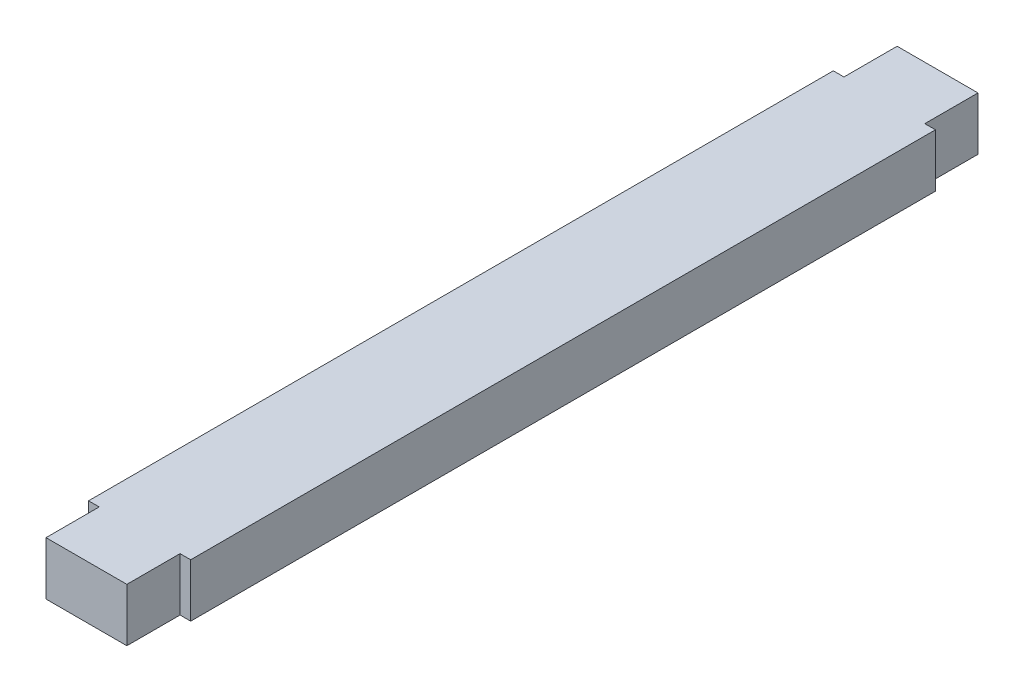
ISO-10303-21;
HEADER;
FILE_DESCRIPTION(('STEP AP214'),'2;1');
FILE_NAME('part.step','',(''),(''),'','','');
FILE_SCHEMA(('AUTOMOTIVE_DESIGN { 1 0 10303 214 1 1 1 1 }'));
ENDSEC;
DATA;
#1=APPLICATION_CONTEXT('core data for automotive mechanical design processes');
#2=APPLICATION_PROTOCOL_DEFINITION('international standard','automotive_design',2000,#1);
#3=PRODUCT_CONTEXT('',#1,'mechanical');
#4=PRODUCT('Part','Part','',(#3));
#5=PRODUCT_RELATED_PRODUCT_CATEGORY('part','',(#4));
#6=PRODUCT_DEFINITION_FORMATION('','',#4);
#7=PRODUCT_DEFINITION_CONTEXT('part definition',#1,'design');
#8=PRODUCT_DEFINITION('design','',#6,#7);
#9=PRODUCT_DEFINITION_SHAPE('','',#8);
#10=(LENGTH_UNIT() NAMED_UNIT(*) SI_UNIT(.MILLI.,.METRE.));
#11=(NAMED_UNIT(*) PLANE_ANGLE_UNIT() SI_UNIT($,.RADIAN.));
#12=(NAMED_UNIT(*) SI_UNIT($,.STERADIAN.) SOLID_ANGLE_UNIT());
#13=UNCERTAINTY_MEASURE_WITH_UNIT(LENGTH_MEASURE(1.E-05),#10,'distance_accuracy_value','');
#14=(GEOMETRIC_REPRESENTATION_CONTEXT(3) GLOBAL_UNCERTAINTY_ASSIGNED_CONTEXT((#13)) GLOBAL_UNIT_ASSIGNED_CONTEXT((#10,
#11,#12)) REPRESENTATION_CONTEXT('',''));
#15=CARTESIAN_POINT('',(0.,0.,0.));
#16=DIRECTION('',(0.,0.,1.));
#17=DIRECTION('',(1.,0.,0.));
#18=AXIS2_PLACEMENT_3D('',#15,#16,#17);
#19=CARTESIAN_POINT('',(0.,6.35,-17.78));
#20=DIRECTION('',(0.,0.,1.));
#21=DIRECTION('',(1.,0.,0.));
#22=AXIS2_PLACEMENT_3D('',#19,#20,#21);
#23=PLANE('',#22);
#24=DIRECTION('',(-1.,0.,0.));
#25=VECTOR('',#24,1.);
#26=CARTESIAN_POINT('',(0.,0.,-17.78));
#27=LINE('',#26,#25);
#28=CARTESIAN_POINT('',(0.,0.,-17.78));
#29=VERTEX_POINT('',#28);
#30=CARTESIAN_POINT('',(-1.27,0.,-17.78));
#31=VERTEX_POINT('',#30);
#32=EDGE_CURVE('E160',#29,#31,#27,.T.);
#33=ORIENTED_EDGE('',*,*,#32,.T.);
#34=DIRECTION('',(0.,-1.,0.));
#35=VECTOR('',#34,1.);
#36=CARTESIAN_POINT('',(-1.27,6.35,-17.78));
#37=LINE('',#36,#35);
#38=CARTESIAN_POINT('',(-1.27,6.35,-17.78));
#39=VERTEX_POINT('',#38);
#40=EDGE_CURVE('E48',#39,#31,#37,.T.);
#41=ORIENTED_EDGE('',*,*,#40,.F.);
#42=DIRECTION('',(-1.,0.,0.));
#43=VECTOR('',#42,1.);
#44=CARTESIAN_POINT('',(0.,6.35,-17.78));
#45=LINE('',#44,#43);
#46=CARTESIAN_POINT('',(0.,6.35,-17.78));
#47=VERTEX_POINT('',#46);
#48=EDGE_CURVE('E250',#47,#39,#45,.T.);
#49=ORIENTED_EDGE('',*,*,#48,.F.);
#50=DIRECTION('',(0.,-1.,0.));
#51=VECTOR('',#50,1.);
#52=CARTESIAN_POINT('',(0.,6.35,-17.78));
#53=LINE('',#52,#51);
#54=EDGE_CURVE('E11',#47,#29,#53,.T.);
#55=ORIENTED_EDGE('',*,*,#54,.T.);
#56=EDGE_LOOP('',(#33,#41,#49,#55));
#57=FACE_BOUND('',#56,.T.);
#58=ADVANCED_FACE('F40',(#57),#23,.F.);
#59=CARTESIAN_POINT('',(-1.27,6.35,-17.78));
#60=DIRECTION('',(-1.,0.,0.));
#61=DIRECTION('',(0.,0.,1.));
#62=AXIS2_PLACEMENT_3D('',#59,#60,#61);
#63=PLANE('',#62);
#64=DIRECTION('',(0.,0.,-1.));
#65=VECTOR('',#64,1.);
#66=CARTESIAN_POINT('',(-1.27,0.,-17.78));
#67=LINE('',#66,#65);
#68=CARTESIAN_POINT('',(-1.27,0.,-24.13));
#69=VERTEX_POINT('',#68);
#70=EDGE_CURVE('E162',#31,#69,#67,.T.);
#71=ORIENTED_EDGE('',*,*,#70,.T.);
#72=DIRECTION('',(0.,-1.,0.));
#73=VECTOR('',#72,1.);
#74=CARTESIAN_POINT('',(-1.27,6.35,-24.13));
#75=LINE('',#74,#73);
#76=CARTESIAN_POINT('',(-1.27,6.35,-24.13));
#77=VERTEX_POINT('',#76);
#78=EDGE_CURVE('E200',#77,#69,#75,.T.);
#79=ORIENTED_EDGE('',*,*,#78,.F.);
#80=DIRECTION('',(0.,0.,-1.));
#81=VECTOR('',#80,1.);
#82=CARTESIAN_POINT('',(-1.27,6.35,-17.78));
#83=LINE('',#82,#81);
#84=EDGE_CURVE('E209',#39,#77,#83,.T.);
#85=ORIENTED_EDGE('',*,*,#84,.F.);
#86=ORIENTED_EDGE('',*,*,#40,.T.);
#87=EDGE_LOOP('',(#71,#79,#85,#86));
#88=FACE_BOUND('',#87,.T.);
#89=ADVANCED_FACE('F207',(#88),#63,.F.);
#90=CARTESIAN_POINT('',(-1.27,6.35,-24.13));
#91=DIRECTION('',(0.,0.,1.));
#92=DIRECTION('',(1.,0.,0.));
#93=AXIS2_PLACEMENT_3D('',#90,#91,#92);
#94=PLANE('',#93);
#95=DIRECTION('',(-1.,0.,0.));
#96=VECTOR('',#95,1.);
#97=CARTESIAN_POINT('',(-1.27,0.,-24.13));
#98=LINE('',#97,#96);
#99=CARTESIAN_POINT('',(-10.922,0.,-24.13));
#100=VERTEX_POINT('',#99);
#101=EDGE_CURVE('E164',#69,#100,#98,.T.);
#102=ORIENTED_EDGE('',*,*,#101,.T.);
#103=DIRECTION('',(0.,-1.,0.));
#104=VECTOR('',#103,1.);
#105=CARTESIAN_POINT('',(-10.922,6.35,-24.13));
#106=LINE('',#105,#104);
#107=CARTESIAN_POINT('',(-10.922,6.35,-24.13));
#108=VERTEX_POINT('',#107);
#109=EDGE_CURVE('E197',#108,#100,#106,.T.);
#110=ORIENTED_EDGE('',*,*,#109,.F.);
#111=DIRECTION('',(-1.,0.,0.));
#112=VECTOR('',#111,1.);
#113=CARTESIAN_POINT('',(-1.27,6.35,-24.13));
#114=LINE('',#113,#112);
#115=EDGE_CURVE('E230',#77,#108,#114,.T.);
#116=ORIENTED_EDGE('',*,*,#115,.F.);
#117=ORIENTED_EDGE('',*,*,#78,.T.);
#118=EDGE_LOOP('',(#102,#110,#116,#117));
#119=FACE_BOUND('',#118,.T.);
#120=ADVANCED_FACE('F221',(#119),#94,.F.);
#121=CARTESIAN_POINT('',(-10.922,6.35,-24.13));
#122=DIRECTION('',(1.,0.,0.));
#123=DIRECTION('',(0.,0.,-1.));
#124=AXIS2_PLACEMENT_3D('',#121,#122,#123);
#125=PLANE('',#124);
#126=DIRECTION('',(0.,0.,1.));
#127=VECTOR('',#126,1.);
#128=CARTESIAN_POINT('',(-10.922,0.,-24.13));
#129=LINE('',#128,#127);
#130=CARTESIAN_POINT('',(-10.922,0.,-17.78));
#131=VERTEX_POINT('',#130);
#132=EDGE_CURVE('E166',#100,#131,#129,.T.);
#133=ORIENTED_EDGE('',*,*,#132,.T.);
#134=DIRECTION('',(0.,-1.,0.));
#135=VECTOR('',#134,1.);
#136=CARTESIAN_POINT('',(-10.922,6.35,-17.78));
#137=LINE('',#136,#135);
#138=CARTESIAN_POINT('',(-10.922,6.35,-17.78));
#139=VERTEX_POINT('',#138);
#140=EDGE_CURVE('E194',#139,#131,#137,.T.);
#141=ORIENTED_EDGE('',*,*,#140,.F.);
#142=DIRECTION('',(0.,0.,1.));
#143=VECTOR('',#142,1.);
#144=CARTESIAN_POINT('',(-10.922,6.35,-24.13));
#145=LINE('',#144,#143);
#146=EDGE_CURVE('E227',#108,#139,#145,.T.);
#147=ORIENTED_EDGE('',*,*,#146,.F.);
#148=ORIENTED_EDGE('',*,*,#109,.T.);
#149=EDGE_LOOP('',(#133,#141,#147,#148));
#150=FACE_BOUND('',#149,.T.);
#151=ADVANCED_FACE('F225',(#150),#125,.F.);
#152=CARTESIAN_POINT('',(-10.922,6.35,-17.78));
#153=DIRECTION('',(0.,0.,1.));
#154=DIRECTION('',(1.,0.,0.));
#155=AXIS2_PLACEMENT_3D('',#152,#153,#154);
#156=PLANE('',#155);
#157=DIRECTION('',(-1.,0.,0.));
#158=VECTOR('',#157,1.);
#159=CARTESIAN_POINT('',(-10.922,0.,-17.78));
#160=LINE('',#159,#158);
#161=CARTESIAN_POINT('',(-12.192,0.,-17.78));
#162=VERTEX_POINT('',#161);
#163=EDGE_CURVE('E168',#131,#162,#160,.T.);
#164=ORIENTED_EDGE('',*,*,#163,.T.);
#165=DIRECTION('',(0.,-1.,0.));
#166=VECTOR('',#165,1.);
#167=CARTESIAN_POINT('',(-12.192,6.35,-17.78));
#168=LINE('',#167,#166);
#169=CARTESIAN_POINT('',(-12.192,6.35,-17.78));
#170=VERTEX_POINT('',#169);
#171=EDGE_CURVE('E191',#170,#162,#168,.T.);
#172=ORIENTED_EDGE('',*,*,#171,.F.);
#173=DIRECTION('',(-1.,0.,0.));
#174=VECTOR('',#173,1.);
#175=CARTESIAN_POINT('',(-10.922,6.35,-17.78));
#176=LINE('',#175,#174);
#177=EDGE_CURVE('E229',#139,#170,#176,.T.);
#178=ORIENTED_EDGE('',*,*,#177,.F.);
#179=ORIENTED_EDGE('',*,*,#140,.T.);
#180=EDGE_LOOP('',(#164,#172,#178,#179));
#181=FACE_BOUND('',#180,.T.);
#182=ADVANCED_FACE('F264',(#181),#156,.F.);
#183=CARTESIAN_POINT('',(-12.192,6.35,53.34));
#184=DIRECTION('',(1.,0.,0.));
#185=DIRECTION('',(0.,0.,-1.));
#186=AXIS2_PLACEMENT_3D('',#183,#184,#185);
#187=PLANE('',#186);
#188=DIRECTION('',(0.,0.,1.));
#189=VECTOR('',#188,1.);
#190=CARTESIAN_POINT('',(-12.192,0.,53.34));
#191=LINE('',#190,#189);
#192=CARTESIAN_POINT('',(-12.192,0.,71.12));
#193=VERTEX_POINT('',#192);
#194=EDGE_CURVE('E171',#162,#193,#191,.T.);
#195=ORIENTED_EDGE('',*,*,#194,.T.);
#196=DIRECTION('',(0.,-1.,0.));
#197=VECTOR('',#196,1.);
#198=CARTESIAN_POINT('',(-12.192,6.35,71.12));
#199=LINE('',#198,#197);
#200=CARTESIAN_POINT('',(-12.192,6.35,71.12));
#201=VERTEX_POINT('',#200);
#202=EDGE_CURVE('E188',#201,#193,#199,.T.);
#203=ORIENTED_EDGE('',*,*,#202,.F.);
#204=DIRECTION('',(0.,0.,1.));
#205=VECTOR('',#204,1.);
#206=CARTESIAN_POINT('',(-12.192,6.35,-17.78));
#207=LINE('',#206,#205);
#208=EDGE_CURVE('E232',#170,#201,#207,.T.);
#209=ORIENTED_EDGE('',*,*,#208,.F.);
#210=ORIENTED_EDGE('',*,*,#171,.T.);
#211=EDGE_LOOP('',(#195,#203,#209,#210));
#212=FACE_BOUND('',#211,.T.);
#213=ADVANCED_FACE('F267',(#212),#187,.F.);
#214=CARTESIAN_POINT('',(-12.192,6.35,71.12));
#215=DIRECTION('',(0.,0.,-1.));
#216=DIRECTION('',(-1.,0.,0.));
#217=AXIS2_PLACEMENT_3D('',#214,#215,#216);
#218=PLANE('',#217);
#219=DIRECTION('',(1.,0.,0.));
#220=VECTOR('',#219,1.);
#221=CARTESIAN_POINT('',(-12.192,0.,71.12));
#222=LINE('',#221,#220);
#223=CARTESIAN_POINT('',(-10.922,0.,71.12));
#224=VERTEX_POINT('',#223);
#225=EDGE_CURVE('E173',#193,#224,#222,.T.);
#226=ORIENTED_EDGE('',*,*,#225,.T.);
#227=DIRECTION('',(0.,-1.,0.));
#228=VECTOR('',#227,1.);
#229=CARTESIAN_POINT('',(-10.922,6.35,71.12));
#230=LINE('',#229,#228);
#231=CARTESIAN_POINT('',(-10.922,6.35,71.12));
#232=VERTEX_POINT('',#231);
#233=EDGE_CURVE('E185',#232,#224,#230,.T.);
#234=ORIENTED_EDGE('',*,*,#233,.F.);
#235=DIRECTION('',(1.,0.,0.));
#236=VECTOR('',#235,1.);
#237=CARTESIAN_POINT('',(-12.192,6.35,71.12));
#238=LINE('',#237,#236);
#239=EDGE_CURVE('E238',#201,#232,#238,.T.);
#240=ORIENTED_EDGE('',*,*,#239,.F.);
#241=ORIENTED_EDGE('',*,*,#202,.T.);
#242=EDGE_LOOP('',(#226,#234,#240,#241));
#243=FACE_BOUND('',#242,.T.);
#244=ADVANCED_FACE('F244',(#243),#218,.F.);
#245=CARTESIAN_POINT('',(-10.922,6.35,71.12));
#246=DIRECTION('',(1.,0.,0.));
#247=DIRECTION('',(0.,0.,-1.));
#248=AXIS2_PLACEMENT_3D('',#245,#246,#247);
#249=PLANE('',#248);
#250=DIRECTION('',(0.,0.,1.));
#251=VECTOR('',#250,1.);
#252=CARTESIAN_POINT('',(-10.922,0.,71.12));
#253=LINE('',#252,#251);
#254=CARTESIAN_POINT('',(-10.922,0.,77.47));
#255=VERTEX_POINT('',#254);
#256=EDGE_CURVE('E175',#224,#255,#253,.T.);
#257=ORIENTED_EDGE('',*,*,#256,.T.);
#258=DIRECTION('',(0.,-1.,0.));
#259=VECTOR('',#258,1.);
#260=CARTESIAN_POINT('',(-10.922,6.35,77.47));
#261=LINE('',#260,#259);
#262=CARTESIAN_POINT('',(-10.922,6.35,77.47));
#263=VERTEX_POINT('',#262);
#264=EDGE_CURVE('E149',#263,#255,#261,.T.);
#265=ORIENTED_EDGE('',*,*,#264,.F.);
#266=DIRECTION('',(0.,0.,1.));
#267=VECTOR('',#266,1.);
#268=CARTESIAN_POINT('',(-10.922,6.35,71.12));
#269=LINE('',#268,#267);
#270=EDGE_CURVE('E140',#232,#263,#269,.T.);
#271=ORIENTED_EDGE('',*,*,#270,.F.);
#272=ORIENTED_EDGE('',*,*,#233,.T.);
#273=EDGE_LOOP('',(#257,#265,#271,#272));
#274=FACE_BOUND('',#273,.T.);
#275=ADVANCED_FACE('F248',(#274),#249,.F.);
#276=CARTESIAN_POINT('',(-10.922,6.35,77.47));
#277=DIRECTION('',(0.,0.,-1.));
#278=DIRECTION('',(-1.,0.,0.));
#279=AXIS2_PLACEMENT_3D('',#276,#277,#278);
#280=PLANE('',#279);
#281=DIRECTION('',(1.,0.,0.));
#282=VECTOR('',#281,1.);
#283=CARTESIAN_POINT('',(-10.922,0.,77.47));
#284=LINE('',#283,#282);
#285=CARTESIAN_POINT('',(-1.27,0.,77.47));
#286=VERTEX_POINT('',#285);
#287=EDGE_CURVE('E148',#255,#286,#284,.T.);
#288=ORIENTED_EDGE('',*,*,#287,.T.);
#289=DIRECTION('',(0.,-1.,0.));
#290=VECTOR('',#289,1.);
#291=CARTESIAN_POINT('',(-1.27,6.35,77.47));
#292=LINE('',#291,#290);
#293=CARTESIAN_POINT('',(-1.27,6.35,77.47));
#294=VERTEX_POINT('',#293);
#295=EDGE_CURVE('E145',#294,#286,#292,.T.);
#296=ORIENTED_EDGE('',*,*,#295,.F.);
#297=DIRECTION('',(1.,0.,0.));
#298=VECTOR('',#297,1.);
#299=CARTESIAN_POINT('',(-10.922,6.35,77.47));
#300=LINE('',#299,#298);
#301=EDGE_CURVE('E134',#263,#294,#300,.T.);
#302=ORIENTED_EDGE('',*,*,#301,.F.);
#303=ORIENTED_EDGE('',*,*,#264,.T.);
#304=EDGE_LOOP('',(#288,#296,#302,#303));
#305=FACE_BOUND('',#304,.T.);
#306=ADVANCED_FACE('F146',(#305),#280,.F.);
#307=CARTESIAN_POINT('',(-1.27,6.35,77.47));
#308=DIRECTION('',(-1.,0.,0.));
#309=DIRECTION('',(0.,0.,1.));
#310=AXIS2_PLACEMENT_3D('',#307,#308,#309);
#311=PLANE('',#310);
#312=DIRECTION('',(0.,0.,-1.));
#313=VECTOR('',#312,1.);
#314=CARTESIAN_POINT('',(-1.27,0.,77.47));
#315=LINE('',#314,#313);
#316=CARTESIAN_POINT('',(-1.27,0.,71.12));
#317=VERTEX_POINT('',#316);
#318=EDGE_CURVE('E98',#286,#317,#315,.T.);
#319=ORIENTED_EDGE('',*,*,#318,.T.);
#320=DIRECTION('',(0.,-1.,0.));
#321=VECTOR('',#320,1.);
#322=CARTESIAN_POINT('',(-1.27,6.35,71.12));
#323=LINE('',#322,#321);
#324=CARTESIAN_POINT('',(-1.27,6.35,71.12));
#325=VERTEX_POINT('',#324);
#326=EDGE_CURVE('E150',#325,#317,#323,.T.);
#327=ORIENTED_EDGE('',*,*,#326,.F.);
#328=DIRECTION('',(0.,0.,-1.));
#329=VECTOR('',#328,1.);
#330=CARTESIAN_POINT('',(-1.27,6.35,77.47));
#331=LINE('',#330,#329);
#332=EDGE_CURVE('E138',#294,#325,#331,.T.);
#333=ORIENTED_EDGE('',*,*,#332,.F.);
#334=ORIENTED_EDGE('',*,*,#295,.T.);
#335=EDGE_LOOP('',(#319,#327,#333,#334));
#336=FACE_BOUND('',#335,.T.);
#337=ADVANCED_FACE('F152',(#336),#311,.F.);
#338=CARTESIAN_POINT('',(-1.27,6.35,71.12));
#339=DIRECTION('',(0.,0.,-1.));
#340=DIRECTION('',(-1.,0.,0.));
#341=AXIS2_PLACEMENT_3D('',#338,#339,#340);
#342=PLANE('',#341);
#343=DIRECTION('',(1.,0.,0.));
#344=VECTOR('',#343,1.);
#345=CARTESIAN_POINT('',(-1.27,0.,71.12));
#346=LINE('',#345,#344);
#347=CARTESIAN_POINT('',(0.,0.,71.12));
#348=VERTEX_POINT('',#347);
#349=EDGE_CURVE('E105',#317,#348,#346,.T.);
#350=ORIENTED_EDGE('',*,*,#349,.T.);
#351=DIRECTION('',(0.,-1.,0.));
#352=VECTOR('',#351,1.);
#353=CARTESIAN_POINT('',(0.,6.35,71.12));
#354=LINE('',#353,#352);
#355=CARTESIAN_POINT('',(0.,6.35,71.12));
#356=VERTEX_POINT('',#355);
#357=EDGE_CURVE('E156',#356,#348,#354,.T.);
#358=ORIENTED_EDGE('',*,*,#357,.F.);
#359=DIRECTION('',(1.,0.,0.));
#360=VECTOR('',#359,1.);
#361=CARTESIAN_POINT('',(-1.27,6.35,71.12));
#362=LINE('',#361,#360);
#363=EDGE_CURVE('E154',#325,#356,#362,.T.);
#364=ORIENTED_EDGE('',*,*,#363,.F.);
#365=ORIENTED_EDGE('',*,*,#326,.T.);
#366=EDGE_LOOP('',(#350,#358,#364,#365));
#367=FACE_BOUND('',#366,.T.);
#368=ADVANCED_FACE('F280',(#367),#342,.F.);
#369=CARTESIAN_POINT('',(0.,6.35,71.12));
#370=DIRECTION('',(-1.,0.,0.));
#371=DIRECTION('',(0.,0.,1.));
#372=AXIS2_PLACEMENT_3D('',#369,#370,#371);
#373=PLANE('',#372);
#374=DIRECTION('',(0.,0.,-1.));
#375=VECTOR('',#374,1.);
#376=CARTESIAN_POINT('',(0.,0.,71.12));
#377=LINE('',#376,#375);
#378=EDGE_CURVE('E180',#348,#29,#377,.T.);
#379=ORIENTED_EDGE('',*,*,#378,.T.);
#380=ORIENTED_EDGE('',*,*,#54,.F.);
#381=DIRECTION('',(0.,0.,-1.));
#382=VECTOR('',#381,1.);
#383=CARTESIAN_POINT('',(0.,6.35,0.));
#384=LINE('',#383,#382);
#385=EDGE_CURVE('E56',#356,#47,#384,.T.);
#386=ORIENTED_EDGE('',*,*,#385,.F.);
#387=ORIENTED_EDGE('',*,*,#357,.T.);
#388=EDGE_LOOP('',(#379,#380,#386,#387));
#389=FACE_BOUND('',#388,.T.);
#390=ADVANCED_FACE('F249',(#389),#373,.F.);
#391=CARTESIAN_POINT('',(0.,6.35,0.));
#392=DIRECTION('',(0.,1.,0.));
#393=DIRECTION('',(0.,0.,1.));
#394=AXIS2_PLACEMENT_3D('',#391,#392,#393);
#395=PLANE('',#394);
#396=ORIENTED_EDGE('',*,*,#385,.T.);
#397=ORIENTED_EDGE('',*,*,#48,.T.);
#398=ORIENTED_EDGE('',*,*,#84,.T.);
#399=ORIENTED_EDGE('',*,*,#115,.T.);
#400=ORIENTED_EDGE('',*,*,#146,.T.);
#401=ORIENTED_EDGE('',*,*,#177,.T.);
#402=ORIENTED_EDGE('',*,*,#208,.T.);
#403=ORIENTED_EDGE('',*,*,#239,.T.);
#404=ORIENTED_EDGE('',*,*,#270,.T.);
#405=ORIENTED_EDGE('',*,*,#301,.T.);
#406=ORIENTED_EDGE('',*,*,#332,.T.);
#407=ORIENTED_EDGE('',*,*,#363,.T.);
#408=EDGE_LOOP('',(#396,#397,#398,#399,#400,#401,#402,#403,#404,#405,#406,#407));
#409=FACE_BOUND('',#408,.T.);
#410=ADVANCED_FACE('F136',(#409),#395,.T.);
#411=CARTESIAN_POINT('',(0.,0.,0.));
#412=DIRECTION('',(0.,1.,0.));
#413=DIRECTION('',(0.,0.,1.));
#414=AXIS2_PLACEMENT_3D('',#411,#412,#413);
#415=PLANE('',#414);
#416=ORIENTED_EDGE('',*,*,#32,.F.);
#417=ORIENTED_EDGE('',*,*,#378,.F.);
#418=ORIENTED_EDGE('',*,*,#349,.F.);
#419=ORIENTED_EDGE('',*,*,#318,.F.);
#420=ORIENTED_EDGE('',*,*,#287,.F.);
#421=ORIENTED_EDGE('',*,*,#256,.F.);
#422=ORIENTED_EDGE('',*,*,#225,.F.);
#423=ORIENTED_EDGE('',*,*,#194,.F.);
#424=ORIENTED_EDGE('',*,*,#163,.F.);
#425=ORIENTED_EDGE('',*,*,#132,.F.);
#426=ORIENTED_EDGE('',*,*,#101,.F.);
#427=ORIENTED_EDGE('',*,*,#70,.F.);
#428=EDGE_LOOP('',(#416,#417,#418,#419,#420,#421,#422,#423,#424,#425,#426,#427));
#429=FACE_BOUND('',#428,.T.);
#430=ADVANCED_FACE('F215',(#429),#415,.F.);
#431=CLOSED_SHELL('',(#58,#89,#120,#151,#182,#213,#244,#275,#306,#337,#368,#390,#410,#430));
#432=MANIFOLD_SOLID_BREP('B2',#431);
#433=ADVANCED_BREP_SHAPE_REPRESENTATION('',(#18,#432),#14);
#434=SHAPE_DEFINITION_REPRESENTATION(#9,#433);
ENDSEC;
END-ISO-10303-21;
